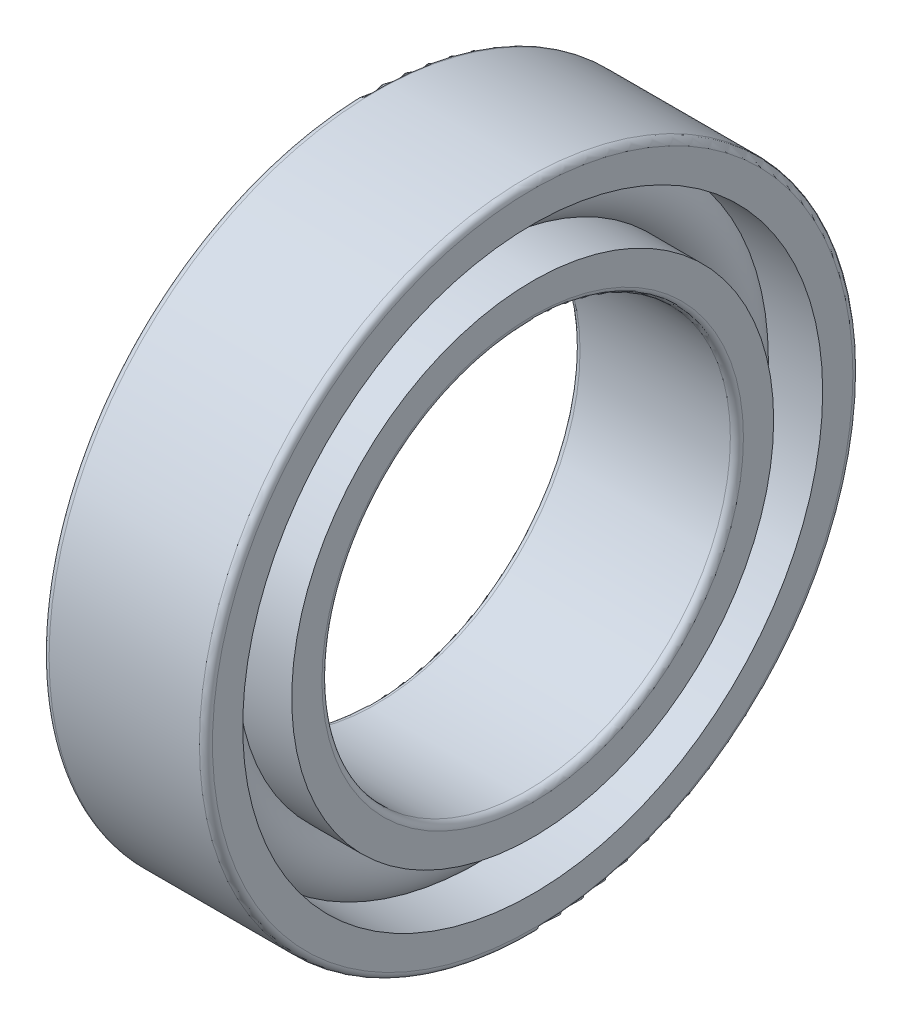
ISO-10303-21;
HEADER;
FILE_DESCRIPTION(('STEP AP214'),'2;1');
FILE_NAME('part.step','',(''),(''),'','','');
FILE_SCHEMA(('AUTOMOTIVE_DESIGN { 1 0 10303 214 1 1 1 1 }'));
ENDSEC;
DATA;
#1=APPLICATION_CONTEXT('core data for automotive mechanical design processes');
#2=APPLICATION_PROTOCOL_DEFINITION('international standard','automotive_design',2000,#1);
#3=PRODUCT_CONTEXT('',#1,'mechanical');
#4=PRODUCT('Part','Part','',(#3));
#5=PRODUCT_RELATED_PRODUCT_CATEGORY('part','',(#4));
#6=PRODUCT_DEFINITION_FORMATION('','',#4);
#7=PRODUCT_DEFINITION_CONTEXT('part definition',#1,'design');
#8=PRODUCT_DEFINITION('design','',#6,#7);
#9=PRODUCT_DEFINITION_SHAPE('','',#8);
#10=(LENGTH_UNIT() NAMED_UNIT(*) SI_UNIT(.MILLI.,.METRE.));
#11=(NAMED_UNIT(*) PLANE_ANGLE_UNIT() SI_UNIT($,.RADIAN.));
#12=(NAMED_UNIT(*) SI_UNIT($,.STERADIAN.) SOLID_ANGLE_UNIT());
#13=UNCERTAINTY_MEASURE_WITH_UNIT(LENGTH_MEASURE(1.E-05),#10,'distance_accuracy_value','');
#14=(GEOMETRIC_REPRESENTATION_CONTEXT(3) GLOBAL_UNCERTAINTY_ASSIGNED_CONTEXT((#13)) GLOBAL_UNIT_ASSIGNED_CONTEXT((#10,
#11,#12)) REPRESENTATION_CONTEXT('',''));
#15=CARTESIAN_POINT('',(0.,0.,0.));
#16=DIRECTION('',(0.,0.,1.));
#17=DIRECTION('',(1.,0.,0.));
#18=AXIS2_PLACEMENT_3D('',#15,#16,#17);
#19=CARTESIAN_POINT('',(0.,0.,0.));
#20=DIRECTION('',(-1.,0.,0.));
#21=DIRECTION('',(0.,0.,1.));
#22=AXIS2_PLACEMENT_3D('',#19,#20,#21);
#23=TOROIDAL_SURFACE('',#22,3.25,0.45);
#24=CARTESIAN_POINT('',(0.335410196624964,0.,0.));
#25=DIRECTION('',(-1.,0.,0.));
#26=DIRECTION('',(0.,0.,1.));
#27=AXIS2_PLACEMENT_3D('',#24,#25,#26);
#28=CIRCLE('',#27,3.55);
#29=CARTESIAN_POINT('',(0.335410196624964,0.,3.55));
#30=VERTEX_POINT('',#29);
#31=EDGE_CURVE('E43',#30,#30,#28,.F.);
#32=ORIENTED_EDGE('',*,*,#31,.T.);
#33=EDGE_LOOP('',(#32));
#34=FACE_BOUND('',#33,.T.);
#35=CARTESIAN_POINT('',(0.335410196624969,0.,0.));
#36=DIRECTION('',(-1.,0.,0.));
#37=DIRECTION('',(0.,0.,1.));
#38=AXIS2_PLACEMENT_3D('',#35,#36,#37);
#39=CIRCLE('',#38,2.95);
#40=CARTESIAN_POINT('',(0.335410196624969,0.,2.95));
#41=VERTEX_POINT('',#40);
#42=EDGE_CURVE('E10',#41,#41,#39,.T.);
#43=ORIENTED_EDGE('',*,*,#42,.T.);
#44=EDGE_LOOP('',(#43));
#45=FACE_BOUND('',#44,.T.);
#46=ADVANCED_FACE('F39',(#34,#45),#23,.T.);
#47=CARTESIAN_POINT('',(-20.6375,0.,0.));
#48=DIRECTION('',(1.,0.,0.));
#49=DIRECTION('',(0.,0.,-1.));
#50=AXIS2_PLACEMENT_3D('',#47,#48,#49);
#51=CYLINDRICAL_SURFACE('',#50,2.95);
#52=CARTESIAN_POINT('',(1.,0.,0.));
#53=DIRECTION('',(1.,0.,0.));
#54=DIRECTION('',(0.,0.,-1.));
#55=AXIS2_PLACEMENT_3D('',#52,#53,#54);
#56=CIRCLE('',#55,2.95);
#57=CARTESIAN_POINT('',(1.,0.,-2.95));
#58=VERTEX_POINT('',#57);
#59=EDGE_CURVE('E52',#58,#58,#56,.T.);
#60=ORIENTED_EDGE('',*,*,#59,.F.);
#61=EDGE_LOOP('',(#60));
#62=FACE_BOUND('',#61,.T.);
#63=ORIENTED_EDGE('',*,*,#42,.F.);
#64=EDGE_LOOP('',(#63));
#65=FACE_BOUND('',#64,.T.);
#66=ADVANCED_FACE('F91',(#62,#65),#51,.T.);
#67=CARTESIAN_POINT('',(-20.6375,0.,0.));
#68=DIRECTION('',(1.,0.,0.));
#69=DIRECTION('',(0.,0.,-1.));
#70=AXIS2_PLACEMENT_3D('',#67,#68,#69);
#71=CYLINDRICAL_SURFACE('',#70,2.95);
#72=CARTESIAN_POINT('',(-1.,0.,0.));
#73=DIRECTION('',(1.,0.,0.));
#74=DIRECTION('',(0.,0.,-1.));
#75=AXIS2_PLACEMENT_3D('',#72,#73,#74);
#76=CIRCLE('',#75,2.95);
#77=CARTESIAN_POINT('',(-1.,0.,-2.95));
#78=VERTEX_POINT('',#77);
#79=EDGE_CURVE('E61',#78,#78,#76,.T.);
#80=ORIENTED_EDGE('',*,*,#79,.T.);
#81=EDGE_LOOP('',(#80));
#82=FACE_BOUND('',#81,.T.);
#83=CARTESIAN_POINT('',(-0.335410196624969,0.,0.));
#84=DIRECTION('',(1.,0.,0.));
#85=DIRECTION('',(0.,0.,-1.));
#86=AXIS2_PLACEMENT_3D('',#83,#84,#85);
#87=CIRCLE('',#86,2.95);
#88=CARTESIAN_POINT('',(-0.335410196624969,0.,-2.95));
#89=VERTEX_POINT('',#88);
#90=EDGE_CURVE('E47',#89,#89,#87,.T.);
#91=ORIENTED_EDGE('',*,*,#90,.F.);
#92=EDGE_LOOP('',(#91));
#93=FACE_BOUND('',#92,.T.);
#94=ADVANCED_FACE('F94',(#82,#93),#71,.T.);
#95=CARTESIAN_POINT('',(1.,2.58,0.));
#96=DIRECTION('',(1.,0.,0.));
#97=DIRECTION('',(0.,0.,-1.));
#98=AXIS2_PLACEMENT_3D('',#95,#96,#97);
#99=PLANE('',#98);
#100=ORIENTED_EDGE('',*,*,#59,.T.);
#101=EDGE_LOOP('',(#100));
#102=FACE_BOUND('',#101,.T.);
#103=CARTESIAN_POINT('',(1.,0.,0.));
#104=DIRECTION('',(1.,0.,0.));
#105=DIRECTION('',(0.,0.,-1.));
#106=AXIS2_PLACEMENT_3D('',#103,#104,#105);
#107=CIRCLE('',#106,2.58);
#108=CARTESIAN_POINT('',(1.,0.,-2.58));
#109=VERTEX_POINT('',#108);
#110=EDGE_CURVE('E83',#109,#109,#107,.T.);
#111=ORIENTED_EDGE('',*,*,#110,.F.);
#112=EDGE_LOOP('',(#111));
#113=FACE_BOUND('',#112,.T.);
#114=ADVANCED_FACE('F88',(#102,#113),#99,.T.);
#115=CARTESIAN_POINT('',(0.92,0.,0.));
#116=DIRECTION('',(1.,0.,0.));
#117=DIRECTION('',(0.,0.,-1.));
#118=AXIS2_PLACEMENT_3D('',#115,#116,#117);
#119=TOROIDAL_SURFACE('',#118,2.58,0.0800000000000008);
#120=ORIENTED_EDGE('',*,*,#110,.T.);
#121=EDGE_LOOP('',(#120));
#122=FACE_BOUND('',#121,.T.);
#123=CARTESIAN_POINT('',(0.920000000000001,0.,0.));
#124=DIRECTION('',(1.,0.,0.));
#125=DIRECTION('',(0.,0.,-1.));
#126=AXIS2_PLACEMENT_3D('',#123,#124,#125);
#127=CIRCLE('',#126,2.5);
#128=CARTESIAN_POINT('',(0.920000000000001,0.,-2.5));
#129=VERTEX_POINT('',#128);
#130=EDGE_CURVE('E80',#129,#129,#127,.T.);
#131=ORIENTED_EDGE('',*,*,#130,.F.);
#132=EDGE_LOOP('',(#131));
#133=FACE_BOUND('',#132,.T.);
#134=ADVANCED_FACE('F105',(#122,#133),#119,.T.);
#135=CARTESIAN_POINT('',(-20.6375,0.,0.));
#136=DIRECTION('',(1.,0.,0.));
#137=DIRECTION('',(0.,0.,-1.));
#138=AXIS2_PLACEMENT_3D('',#135,#136,#137);
#139=CYLINDRICAL_SURFACE('',#138,2.5);
#140=ORIENTED_EDGE('',*,*,#130,.T.);
#141=EDGE_LOOP('',(#140));
#142=FACE_BOUND('',#141,.T.);
#143=CARTESIAN_POINT('',(-0.920000000000001,0.,0.));
#144=DIRECTION('',(1.,0.,0.));
#145=DIRECTION('',(0.,0.,-1.));
#146=AXIS2_PLACEMENT_3D('',#143,#144,#145);
#147=CIRCLE('',#146,2.5);
#148=CARTESIAN_POINT('',(-0.920000000000001,0.,-2.5));
#149=VERTEX_POINT('',#148);
#150=EDGE_CURVE('E77',#149,#149,#147,.T.);
#151=ORIENTED_EDGE('',*,*,#150,.F.);
#152=EDGE_LOOP('',(#151));
#153=FACE_BOUND('',#152,.T.);
#154=ADVANCED_FACE('F108',(#142,#153),#139,.F.);
#155=CARTESIAN_POINT('',(-0.92,0.,0.));
#156=DIRECTION('',(1.,0.,0.));
#157=DIRECTION('',(0.,0.,-1.));
#158=AXIS2_PLACEMENT_3D('',#155,#156,#157);
#159=TOROIDAL_SURFACE('',#158,2.58,0.0800000000000008);
#160=ORIENTED_EDGE('',*,*,#150,.T.);
#161=EDGE_LOOP('',(#160));
#162=FACE_BOUND('',#161,.T.);
#163=CARTESIAN_POINT('',(-1.,0.,0.));
#164=DIRECTION('',(1.,0.,0.));
#165=DIRECTION('',(0.,0.,-1.));
#166=AXIS2_PLACEMENT_3D('',#163,#164,#165);
#167=CIRCLE('',#166,2.58);
#168=CARTESIAN_POINT('',(-1.,0.,-2.58));
#169=VERTEX_POINT('',#168);
#170=EDGE_CURVE('E74',#169,#169,#167,.T.);
#171=ORIENTED_EDGE('',*,*,#170,.F.);
#172=EDGE_LOOP('',(#171));
#173=FACE_BOUND('',#172,.T.);
#174=ADVANCED_FACE('F112',(#162,#173),#159,.T.);
#175=CARTESIAN_POINT('',(-1.,2.95,0.));
#176=DIRECTION('',(-1.,0.,0.));
#177=DIRECTION('',(0.,0.,1.));
#178=AXIS2_PLACEMENT_3D('',#175,#176,#177);
#179=PLANE('',#178);
#180=ORIENTED_EDGE('',*,*,#170,.T.);
#181=EDGE_LOOP('',(#180));
#182=FACE_BOUND('',#181,.T.);
#183=ORIENTED_EDGE('',*,*,#79,.F.);
#184=EDGE_LOOP('',(#183));
#185=FACE_BOUND('',#184,.T.);
#186=ADVANCED_FACE('F116',(#182,#185),#179,.T.);
#187=CARTESIAN_POINT('',(-0.335410196624964,0.,0.));
#188=DIRECTION('',(1.,0.,0.));
#189=DIRECTION('',(0.,0.,-1.));
#190=AXIS2_PLACEMENT_3D('',#187,#188,#189);
#191=CIRCLE('',#190,3.55);
#192=CARTESIAN_POINT('',(-0.335410196624964,0.,-3.55));
#193=VERTEX_POINT('',#192);
#194=EDGE_CURVE('E55',#193,#193,#191,.F.);
#195=ORIENTED_EDGE('',*,*,#194,.T.);
#196=EDGE_LOOP('',(#195));
#197=FACE_BOUND('',#196,.T.);
#198=ORIENTED_EDGE('',*,*,#90,.T.);
#199=EDGE_LOOP('',(#198));
#200=FACE_BOUND('',#199,.T.);
#201=ADVANCED_FACE('F41',(#197,#200),#23,.T.);
#202=CARTESIAN_POINT('',(-20.6375,0.,0.));
#203=DIRECTION('',(1.,0.,0.));
#204=DIRECTION('',(0.,0.,-1.));
#205=AXIS2_PLACEMENT_3D('',#202,#203,#204);
#206=CYLINDRICAL_SURFACE('',#205,3.55);
#207=CARTESIAN_POINT('',(1.,0.,0.));
#208=DIRECTION('',(1.,0.,0.));
#209=DIRECTION('',(0.,0.,-1.));
#210=AXIS2_PLACEMENT_3D('',#207,#208,#209);
#211=CIRCLE('',#210,3.55);
#212=CARTESIAN_POINT('',(1.,0.,-3.55));
#213=VERTEX_POINT('',#212);
#214=EDGE_CURVE('E57',#213,#213,#211,.T.);
#215=ORIENTED_EDGE('',*,*,#214,.T.);
#216=EDGE_LOOP('',(#215));
#217=FACE_BOUND('',#216,.T.);
#218=ORIENTED_EDGE('',*,*,#31,.F.);
#219=EDGE_LOOP('',(#218));
#220=FACE_BOUND('',#219,.T.);
#221=ADVANCED_FACE('F121',(#217,#220),#206,.F.);
#222=CARTESIAN_POINT('',(-20.6375,0.,0.));
#223=DIRECTION('',(1.,0.,0.));
#224=DIRECTION('',(0.,0.,-1.));
#225=AXIS2_PLACEMENT_3D('',#222,#223,#224);
#226=CYLINDRICAL_SURFACE('',#225,3.55);
#227=CARTESIAN_POINT('',(-1.,0.,0.));
#228=DIRECTION('',(1.,0.,0.));
#229=DIRECTION('',(0.,0.,-1.));
#230=AXIS2_PLACEMENT_3D('',#227,#228,#229);
#231=CIRCLE('',#230,3.55);
#232=CARTESIAN_POINT('',(-1.,0.,-3.55));
#233=VERTEX_POINT('',#232);
#234=EDGE_CURVE('E152',#233,#233,#231,.T.);
#235=ORIENTED_EDGE('',*,*,#234,.F.);
#236=EDGE_LOOP('',(#235));
#237=FACE_BOUND('',#236,.T.);
#238=ORIENTED_EDGE('',*,*,#194,.F.);
#239=EDGE_LOOP('',(#238));
#240=FACE_BOUND('',#239,.T.);
#241=ADVANCED_FACE('F124',(#237,#240),#226,.F.);
#242=CARTESIAN_POINT('',(1.,3.92,0.));
#243=DIRECTION('',(1.,0.,0.));
#244=DIRECTION('',(0.,0.,-1.));
#245=AXIS2_PLACEMENT_3D('',#242,#243,#244);
#246=PLANE('',#245);
#247=CARTESIAN_POINT('',(1.,0.,0.));
#248=DIRECTION('',(1.,0.,0.));
#249=DIRECTION('',(0.,0.,-1.));
#250=AXIS2_PLACEMENT_3D('',#247,#248,#249);
#251=CIRCLE('',#250,3.92);
#252=CARTESIAN_POINT('',(1.,0.,-3.92));
#253=VERTEX_POINT('',#252);
#254=EDGE_CURVE('E63',#253,#253,#251,.T.);
#255=ORIENTED_EDGE('',*,*,#254,.T.);
#256=EDGE_LOOP('',(#255));
#257=FACE_BOUND('',#256,.T.);
#258=ORIENTED_EDGE('',*,*,#214,.F.);
#259=EDGE_LOOP('',(#258));
#260=FACE_BOUND('',#259,.T.);
#261=ADVANCED_FACE('F125',(#257,#260),#246,.T.);
#262=CARTESIAN_POINT('',(0.92,0.,0.));
#263=DIRECTION('',(1.,0.,0.));
#264=DIRECTION('',(0.,0.,-1.));
#265=AXIS2_PLACEMENT_3D('',#262,#263,#264);
#266=TOROIDAL_SURFACE('',#265,3.92,0.0800000000000002);
#267=CARTESIAN_POINT('',(0.920000000000001,0.,0.));
#268=DIRECTION('',(1.,0.,0.));
#269=DIRECTION('',(0.,0.,-1.));
#270=AXIS2_PLACEMENT_3D('',#267,#268,#269);
#271=CIRCLE('',#270,4.);
#272=CARTESIAN_POINT('',(0.920000000000001,0.,-4.));
#273=VERTEX_POINT('',#272);
#274=EDGE_CURVE('E68',#273,#273,#271,.T.);
#275=ORIENTED_EDGE('',*,*,#274,.T.);
#276=EDGE_LOOP('',(#275));
#277=FACE_BOUND('',#276,.T.);
#278=ORIENTED_EDGE('',*,*,#254,.F.);
#279=EDGE_LOOP('',(#278));
#280=FACE_BOUND('',#279,.T.);
#281=ADVANCED_FACE('F128',(#277,#280),#266,.T.);
#282=CARTESIAN_POINT('',(-20.6375,0.,0.));
#283=DIRECTION('',(1.,0.,0.));
#284=DIRECTION('',(0.,0.,-1.));
#285=AXIS2_PLACEMENT_3D('',#282,#283,#284);
#286=CYLINDRICAL_SURFACE('',#285,4.);
#287=CARTESIAN_POINT('',(-0.920000000000001,0.,0.));
#288=DIRECTION('',(1.,0.,0.));
#289=DIRECTION('',(0.,0.,-1.));
#290=AXIS2_PLACEMENT_3D('',#287,#288,#289);
#291=CIRCLE('',#290,4.);
#292=CARTESIAN_POINT('',(-0.920000000000001,0.,-4.));
#293=VERTEX_POINT('',#292);
#294=EDGE_CURVE('E156',#293,#293,#291,.T.);
#295=ORIENTED_EDGE('',*,*,#294,.T.);
#296=EDGE_LOOP('',(#295));
#297=FACE_BOUND('',#296,.T.);
#298=ORIENTED_EDGE('',*,*,#274,.F.);
#299=EDGE_LOOP('',(#298));
#300=FACE_BOUND('',#299,.T.);
#301=ADVANCED_FACE('F132',(#297,#300),#286,.T.);
#302=CARTESIAN_POINT('',(-0.92,0.,0.));
#303=DIRECTION('',(1.,0.,0.));
#304=DIRECTION('',(0.,0.,-1.));
#305=AXIS2_PLACEMENT_3D('',#302,#303,#304);
#306=TOROIDAL_SURFACE('',#305,3.92,0.0800000000000002);
#307=CARTESIAN_POINT('',(-1.,0.,0.));
#308=DIRECTION('',(1.,0.,0.));
#309=DIRECTION('',(0.,0.,-1.));
#310=AXIS2_PLACEMENT_3D('',#307,#308,#309);
#311=CIRCLE('',#310,3.92);
#312=CARTESIAN_POINT('',(-1.,0.,-3.92));
#313=VERTEX_POINT('',#312);
#314=EDGE_CURVE('E153',#313,#313,#311,.T.);
#315=ORIENTED_EDGE('',*,*,#314,.T.);
#316=EDGE_LOOP('',(#315));
#317=FACE_BOUND('',#316,.T.);
#318=ORIENTED_EDGE('',*,*,#294,.F.);
#319=EDGE_LOOP('',(#318));
#320=FACE_BOUND('',#319,.T.);
#321=ADVANCED_FACE('F136',(#317,#320),#306,.T.);
#322=CARTESIAN_POINT('',(-1.,3.55,0.));
#323=DIRECTION('',(-1.,0.,0.));
#324=DIRECTION('',(0.,0.,1.));
#325=AXIS2_PLACEMENT_3D('',#322,#323,#324);
#326=PLANE('',#325);
#327=ORIENTED_EDGE('',*,*,#234,.T.);
#328=EDGE_LOOP('',(#327));
#329=FACE_BOUND('',#328,.T.);
#330=ORIENTED_EDGE('',*,*,#314,.F.);
#331=EDGE_LOOP('',(#330));
#332=FACE_BOUND('',#331,.T.);
#333=ADVANCED_FACE('F140',(#329,#332),#326,.T.);
#334=CLOSED_SHELL('',(#46,#66,#94,#114,#134,#154,#174,#186,#201,#221,#241,#261,#281,#301,#321,#333));
#335=MANIFOLD_SOLID_BREP('B2',#334);
#336=ADVANCED_BREP_SHAPE_REPRESENTATION('',(#18,#335),#14);
#337=SHAPE_DEFINITION_REPRESENTATION(#9,#336);
ENDSEC;
END-ISO-10303-21;
